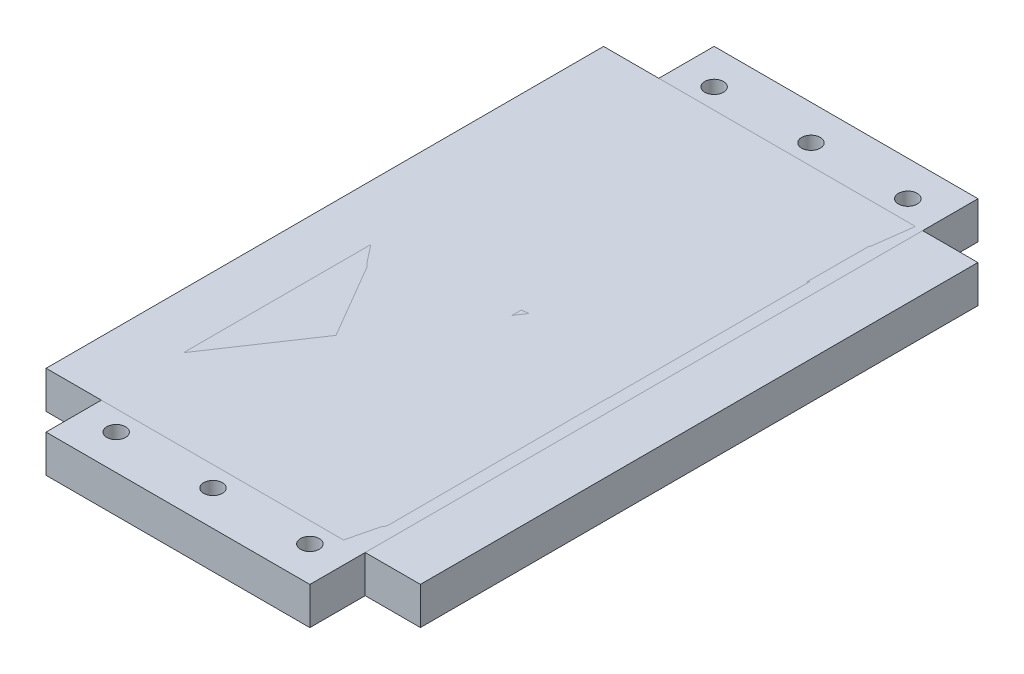
ISO-10303-21;
HEADER;
FILE_DESCRIPTION(('STEP AP214'),'2;1');
FILE_NAME('part.step','',(''),(''),'','','');
FILE_SCHEMA(('AUTOMOTIVE_DESIGN { 1 0 10303 214 1 1 1 1 }'));
ENDSEC;
DATA;
#1=APPLICATION_CONTEXT('core data for automotive mechanical design processes');
#2=APPLICATION_PROTOCOL_DEFINITION('international standard','automotive_design',2000,#1);
#3=PRODUCT_CONTEXT('',#1,'mechanical');
#4=PRODUCT('Part','Part','',(#3));
#5=PRODUCT_RELATED_PRODUCT_CATEGORY('part','',(#4));
#6=PRODUCT_DEFINITION_FORMATION('','',#4);
#7=PRODUCT_DEFINITION_CONTEXT('part definition',#1,'design');
#8=PRODUCT_DEFINITION('design','',#6,#7);
#9=PRODUCT_DEFINITION_SHAPE('','',#8);
#10=(LENGTH_UNIT() NAMED_UNIT(*) SI_UNIT(.MILLI.,.METRE.));
#11=(NAMED_UNIT(*) PLANE_ANGLE_UNIT() SI_UNIT($,.RADIAN.));
#12=(NAMED_UNIT(*) SI_UNIT($,.STERADIAN.) SOLID_ANGLE_UNIT());
#13=UNCERTAINTY_MEASURE_WITH_UNIT(LENGTH_MEASURE(1.E-05),#10,'distance_accuracy_value','');
#14=(GEOMETRIC_REPRESENTATION_CONTEXT(3) GLOBAL_UNCERTAINTY_ASSIGNED_CONTEXT((#13)) GLOBAL_UNIT_ASSIGNED_CONTEXT((#10,
#11,#12)) REPRESENTATION_CONTEXT('',''));
#15=CARTESIAN_POINT('',(0.,0.,0.));
#16=DIRECTION('',(0.,0.,1.));
#17=DIRECTION('',(1.,0.,0.));
#18=AXIS2_PLACEMENT_3D('',#15,#16,#17);
#19=CARTESIAN_POINT('',(68.2,0.,11.825));
#20=DIRECTION('',(1.,0.,0.));
#21=DIRECTION('',(0.,0.,-1.));
#22=AXIS2_PLACEMENT_3D('',#19,#20,#21);
#23=PLANE('',#22);
#24=DIRECTION('',(0.,0.,-1.));
#25=VECTOR('',#24,1.);
#26=CARTESIAN_POINT('',(68.2,8.,11.825));
#27=LINE('',#26,#25);
#28=CARTESIAN_POINT('',(68.2,8.,130.975));
#29=VERTEX_POINT('',#28);
#30=CARTESIAN_POINT('',(68.2,8.,11.825));
#31=VERTEX_POINT('',#30);
#32=EDGE_CURVE('E110',#29,#31,#27,.T.);
#33=ORIENTED_EDGE('',*,*,#32,.F.);
#34=DIRECTION('',(0.,1.,0.));
#35=VECTOR('',#34,1.);
#36=CARTESIAN_POINT('',(68.2,0.,130.975));
#37=LINE('',#36,#35);
#38=CARTESIAN_POINT('',(68.2,0.,130.975));
#39=VERTEX_POINT('',#38);
#40=EDGE_CURVE('E12',#39,#29,#37,.T.);
#41=ORIENTED_EDGE('',*,*,#40,.F.);
#42=DIRECTION('',(0.,0.,-1.));
#43=VECTOR('',#42,1.);
#44=CARTESIAN_POINT('',(68.2,0.,11.825));
#45=LINE('',#44,#43);
#46=CARTESIAN_POINT('',(68.2,0.,11.825));
#47=VERTEX_POINT('',#46);
#48=EDGE_CURVE('E104',#39,#47,#45,.T.);
#49=ORIENTED_EDGE('',*,*,#48,.T.);
#50=DIRECTION('',(0.,1.,0.));
#51=VECTOR('',#50,1.);
#52=CARTESIAN_POINT('',(68.2,0.,11.825));
#53=LINE('',#52,#51);
#54=EDGE_CURVE('E49',#47,#31,#53,.T.);
#55=ORIENTED_EDGE('',*,*,#54,.T.);
#56=EDGE_LOOP('',(#33,#41,#49,#55));
#57=FACE_BOUND('',#56,.T.);
#58=ADVANCED_FACE('F46',(#57),#23,.T.);
#59=CARTESIAN_POINT('',(-11.8,0.,130.975));
#60=DIRECTION('',(0.,0.,1.));
#61=DIRECTION('',(1.,0.,0.));
#62=AXIS2_PLACEMENT_3D('',#59,#60,#61);
#63=PLANE('',#62);
#64=DIRECTION('',(1.,0.,0.));
#65=VECTOR('',#64,1.);
#66=CARTESIAN_POINT('',(-11.8,8.,130.975));
#67=LINE('',#66,#65);
#68=CARTESIAN_POINT('',(-11.8,8.,130.975));
#69=VERTEX_POINT('',#68);
#70=EDGE_CURVE('E106',#69,#29,#67,.T.);
#71=ORIENTED_EDGE('',*,*,#70,.F.);
#72=DIRECTION('',(0.,1.,0.));
#73=VECTOR('',#72,1.);
#74=CARTESIAN_POINT('',(-11.8,0.,130.975));
#75=LINE('',#74,#73);
#76=CARTESIAN_POINT('',(-11.8,0.,130.975));
#77=VERTEX_POINT('',#76);
#78=EDGE_CURVE('E55',#77,#69,#75,.T.);
#79=ORIENTED_EDGE('',*,*,#78,.F.);
#80=DIRECTION('',(1.,0.,0.));
#81=VECTOR('',#80,1.);
#82=CARTESIAN_POINT('',(-11.8,0.,130.975));
#83=LINE('',#82,#81);
#84=EDGE_CURVE('E101',#77,#39,#83,.T.);
#85=ORIENTED_EDGE('',*,*,#84,.T.);
#86=ORIENTED_EDGE('',*,*,#40,.T.);
#87=EDGE_LOOP('',(#71,#79,#85,#86));
#88=FACE_BOUND('',#87,.T.);
#89=ADVANCED_FACE('F120',(#88),#63,.T.);
#90=CARTESIAN_POINT('',(-11.8,0.,11.825));
#91=DIRECTION('',(-1.,0.,0.));
#92=DIRECTION('',(0.,0.,1.));
#93=AXIS2_PLACEMENT_3D('',#90,#91,#92);
#94=PLANE('',#93);
#95=DIRECTION('',(0.,0.,1.));
#96=VECTOR('',#95,1.);
#97=CARTESIAN_POINT('',(-11.8,8.,11.825));
#98=LINE('',#97,#96);
#99=CARTESIAN_POINT('',(-11.8,8.,11.825));
#100=VERTEX_POINT('',#99);
#101=EDGE_CURVE('E96',#100,#69,#98,.T.);
#102=ORIENTED_EDGE('',*,*,#101,.F.);
#103=DIRECTION('',(0.,1.,0.));
#104=VECTOR('',#103,1.);
#105=CARTESIAN_POINT('',(-11.8,0.,11.825));
#106=LINE('',#105,#104);
#107=CARTESIAN_POINT('',(-11.8,0.,11.825));
#108=VERTEX_POINT('',#107);
#109=EDGE_CURVE('E91',#108,#100,#106,.T.);
#110=ORIENTED_EDGE('',*,*,#109,.F.);
#111=DIRECTION('',(0.,0.,1.));
#112=VECTOR('',#111,1.);
#113=CARTESIAN_POINT('',(-11.8,0.,11.825));
#114=LINE('',#113,#112);
#115=EDGE_CURVE('E94',#108,#77,#114,.T.);
#116=ORIENTED_EDGE('',*,*,#115,.T.);
#117=ORIENTED_EDGE('',*,*,#78,.T.);
#118=EDGE_LOOP('',(#102,#110,#116,#117));
#119=FACE_BOUND('',#118,.T.);
#120=ADVANCED_FACE('F93',(#119),#94,.T.);
#121=CARTESIAN_POINT('',(-11.8,0.,11.825));
#122=DIRECTION('',(0.,0.,-1.));
#123=DIRECTION('',(-1.,0.,0.));
#124=AXIS2_PLACEMENT_3D('',#121,#122,#123);
#125=PLANE('',#124);
#126=DIRECTION('',(-1.,0.,0.));
#127=VECTOR('',#126,1.);
#128=CARTESIAN_POINT('',(-11.8,8.,11.825));
#129=LINE('',#128,#127);
#130=EDGE_CURVE('E113',#31,#100,#129,.T.);
#131=ORIENTED_EDGE('',*,*,#130,.F.);
#132=ORIENTED_EDGE('',*,*,#54,.F.);
#133=DIRECTION('',(-1.,0.,0.));
#134=VECTOR('',#133,1.);
#135=CARTESIAN_POINT('',(-11.8,0.,11.825));
#136=LINE('',#135,#134);
#137=EDGE_CURVE('E100',#47,#108,#136,.T.);
#138=ORIENTED_EDGE('',*,*,#137,.T.);
#139=ORIENTED_EDGE('',*,*,#109,.T.);
#140=EDGE_LOOP('',(#131,#132,#138,#139));
#141=FACE_BOUND('',#140,.T.);
#142=ADVANCED_FACE('F103',(#141),#125,.T.);
#143=CARTESIAN_POINT('',(0.,0.,0.));
#144=DIRECTION('',(0.,1.,0.));
#145=DIRECTION('',(0.,0.,1.));
#146=AXIS2_PLACEMENT_3D('',#143,#144,#145);
#147=PLANE('',#146);
#148=ORIENTED_EDGE('',*,*,#48,.F.);
#149=ORIENTED_EDGE('',*,*,#84,.F.);
#150=ORIENTED_EDGE('',*,*,#115,.F.);
#151=ORIENTED_EDGE('',*,*,#137,.F.);
#152=EDGE_LOOP('',(#148,#149,#150,#151));
#153=FACE_BOUND('',#152,.T.);
#154=ADVANCED_FACE('F99',(#153),#147,.F.);
#155=CARTESIAN_POINT('',(0.,8.,0.));
#156=DIRECTION('',(0.,1.,0.));
#157=DIRECTION('',(0.,0.,1.));
#158=AXIS2_PLACEMENT_3D('',#155,#156,#157);
#159=PLANE('',#158);
#160=ORIENTED_EDGE('',*,*,#32,.T.);
#161=ORIENTED_EDGE('',*,*,#130,.T.);
#162=ORIENTED_EDGE('',*,*,#101,.T.);
#163=ORIENTED_EDGE('',*,*,#70,.T.);
#164=EDGE_LOOP('',(#160,#161,#162,#163));
#165=FACE_BOUND('',#164,.T.);
#166=ADVANCED_FACE('F119',(#165),#159,.T.);
#167=CLOSED_SHELL('',(#58,#89,#120,#142,#154,#166));
#168=MANIFOLD_SOLID_BREP('B2_NOT_SHOWN',#167);
#169=CARTESIAN_POINT('',(0.,8.,0.));
#170=DIRECTION('',(0.,1.,0.));
#171=DIRECTION('',(0.,0.,1.));
#172=AXIS2_PLACEMENT_3D('',#169,#170,#171);
#173=PLANE('',#172);
#174=DIRECTION('',(-1.,0.,0.));
#175=VECTOR('',#174,1.);
#176=CARTESIAN_POINT('',(-0.800000000000002,8.,69.4));
#177=LINE('',#176,#175);
#178=CARTESIAN_POINT('',(28.2,8.,69.4));
#179=VERTEX_POINT('',#178);
#180=CARTESIAN_POINT('',(0.,8.,69.4));
#181=VERTEX_POINT('',#180);
#182=EDGE_CURVE('E253',#179,#181,#177,.T.);
#183=ORIENTED_EDGE('',*,*,#182,.F.);
#184=DIRECTION('',(0.,0.,-1.));
#185=VECTOR('',#184,1.);
#186=CARTESIAN_POINT('',(28.2,8.,69.4));
#187=LINE('',#186,#185);
#188=CARTESIAN_POINT('',(28.2,8.,73.4));
#189=VERTEX_POINT('',#188);
#190=EDGE_CURVE('E269',#189,#179,#187,.T.);
#191=ORIENTED_EDGE('',*,*,#190,.F.);
#192=DIRECTION('',(1.,0.,0.));
#193=VECTOR('',#192,1.);
#194=CARTESIAN_POINT('',(-0.799999999999992,8.,73.4));
#195=LINE('',#194,#193);
#196=CARTESIAN_POINT('',(0.,8.,73.4));
#197=VERTEX_POINT('',#196);
#198=EDGE_CURVE('E258',#197,#189,#195,.T.);
#199=ORIENTED_EDGE('',*,*,#198,.F.);
#200=DIRECTION('',(0.,0.,1.));
#201=VECTOR('',#200,1.);
#202=CARTESIAN_POINT('',(0.,8.,0.));
#203=LINE('',#202,#201);
#204=CARTESIAN_POINT('',(0.,8.,142.8));
#205=VERTEX_POINT('',#204);
#206=EDGE_CURVE('E222',#197,#205,#203,.T.);
#207=ORIENTED_EDGE('',*,*,#206,.T.);
#208=DIRECTION('',(1.,0.,0.));
#209=VECTOR('',#208,1.);
#210=CARTESIAN_POINT('',(0.,8.,142.8));
#211=LINE('',#210,#209);
#212=CARTESIAN_POINT('',(56.4,8.,142.8));
#213=VERTEX_POINT('',#212);
#214=EDGE_CURVE('E366',#205,#213,#211,.T.);
#215=ORIENTED_EDGE('',*,*,#214,.T.);
#216=DIRECTION('',(0.,0.,-1.));
#217=VECTOR('',#216,1.);
#218=CARTESIAN_POINT('',(56.4,8.,0.));
#219=LINE('',#218,#217);
#220=CARTESIAN_POINT('',(56.4,8.,0.));
#221=VERTEX_POINT('',#220);
#222=EDGE_CURVE('E368',#213,#221,#219,.T.);
#223=ORIENTED_EDGE('',*,*,#222,.T.);
#224=DIRECTION('',(-1.,0.,0.));
#225=VECTOR('',#224,1.);
#226=CARTESIAN_POINT('',(0.,8.,0.));
#227=LINE('',#226,#225);
#228=CARTESIAN_POINT('',(0.,8.,0.));
#229=VERTEX_POINT('',#228);
#230=EDGE_CURVE('E194',#221,#229,#227,.T.);
#231=ORIENTED_EDGE('',*,*,#230,.T.);
#232=EDGE_CURVE('E364',#229,#181,#203,.T.);
#233=ORIENTED_EDGE('',*,*,#232,.T.);
#234=EDGE_LOOP('',(#183,#191,#199,#207,#215,#223,#231,#233));
#235=FACE_BOUND('',#234,.T.);
#236=CARTESIAN_POINT('',(28.2,8.,135.3));
#237=DIRECTION('',(0.,-1.,0.));
#238=DIRECTION('',(0.,0.,-1.));
#239=AXIS2_PLACEMENT_3D('',#236,#237,#238);
#240=CIRCLE('',#239,2.);
#241=CARTESIAN_POINT('',(28.2,8.,133.3));
#242=VERTEX_POINT('',#241);
#243=EDGE_CURVE('E277',#242,#242,#240,.T.);
#244=ORIENTED_EDGE('',*,*,#243,.T.);
#245=EDGE_LOOP('',(#244));
#246=FACE_BOUND('',#245,.T.);
#247=CARTESIAN_POINT('',(4.58,8.,75.98));
#248=DIRECTION('',(0.,-1.,0.));
#249=DIRECTION('',(0.,0.,1.));
#250=AXIS2_PLACEMENT_3D('',#247,#248,#249);
#251=CIRCLE('',#250,2.);
#252=CARTESIAN_POINT('',(4.58,8.,77.98));
#253=VERTEX_POINT('',#252);
#254=EDGE_CURVE('E301',#253,#253,#251,.T.);
#255=ORIENTED_EDGE('',*,*,#254,.T.);
#256=EDGE_LOOP('',(#255));
#257=FACE_BOUND('',#256,.T.);
#258=CARTESIAN_POINT('',(51.82,8.,123.22));
#259=DIRECTION('',(0.,-1.,0.));
#260=DIRECTION('',(0.,0.,1.));
#261=AXIS2_PLACEMENT_3D('',#258,#259,#260);
#262=CIRCLE('',#261,2.);
#263=CARTESIAN_POINT('',(51.82,8.,125.22));
#264=VERTEX_POINT('',#263);
#265=EDGE_CURVE('E307',#264,#264,#262,.T.);
#266=ORIENTED_EDGE('',*,*,#265,.T.);
#267=EDGE_LOOP('',(#266));
#268=FACE_BOUND('',#267,.T.);
#269=CARTESIAN_POINT('',(28.2,8.,43.2));
#270=DIRECTION('',(0.,1.,0.));
#271=DIRECTION('',(0.,0.,1.));
#272=AXIS2_PLACEMENT_3D('',#269,#270,#271);
#273=CIRCLE('',#272,16.);
#274=CARTESIAN_POINT('',(28.2,8.,59.2));
#275=VERTEX_POINT('',#274);
#276=EDGE_CURVE('E355',#275,#275,#273,.T.);
#277=ORIENTED_EDGE('',*,*,#276,.F.);
#278=EDGE_LOOP('',(#277));
#279=FACE_BOUND('',#278,.T.);
#280=CARTESIAN_POINT('',(4.58,8.,19.58));
#281=DIRECTION('',(0.,1.,0.));
#282=DIRECTION('',(0.,0.,1.));
#283=AXIS2_PLACEMENT_3D('',#280,#281,#282);
#284=CIRCLE('',#283,2.);
#285=CARTESIAN_POINT('',(4.58,8.,21.58));
#286=VERTEX_POINT('',#285);
#287=EDGE_CURVE('E343',#286,#286,#284,.T.);
#288=ORIENTED_EDGE('',*,*,#287,.F.);
#289=EDGE_LOOP('',(#288));
#290=FACE_BOUND('',#289,.T.);
#291=CARTESIAN_POINT('',(51.82,8.,19.58));
#292=DIRECTION('',(0.,1.,0.));
#293=DIRECTION('',(0.,0.,-1.));
#294=AXIS2_PLACEMENT_3D('',#291,#292,#293);
#295=CIRCLE('',#294,2.);
#296=CARTESIAN_POINT('',(51.82,8.,17.58));
#297=VERTEX_POINT('',#296);
#298=EDGE_CURVE('E337',#297,#297,#295,.T.);
#299=ORIENTED_EDGE('',*,*,#298,.F.);
#300=EDGE_LOOP('',(#299));
#301=FACE_BOUND('',#300,.T.);
#302=CARTESIAN_POINT('',(51.82,8.,66.82));
#303=DIRECTION('',(0.,1.,0.));
#304=DIRECTION('',(0.,0.,1.));
#305=AXIS2_PLACEMENT_3D('',#302,#303,#304);
#306=CIRCLE('',#305,2.);
#307=CARTESIAN_POINT('',(51.82,8.,68.82));
#308=VERTEX_POINT('',#307);
#309=EDGE_CURVE('E331',#308,#308,#306,.T.);
#310=ORIENTED_EDGE('',*,*,#309,.F.);
#311=EDGE_LOOP('',(#310));
#312=FACE_BOUND('',#311,.T.);
#313=CARTESIAN_POINT('',(4.58,8.,66.82));
#314=DIRECTION('',(0.,1.,0.));
#315=DIRECTION('',(0.,0.,-1.));
#316=AXIS2_PLACEMENT_3D('',#313,#314,#315);
#317=CIRCLE('',#316,2.);
#318=CARTESIAN_POINT('',(4.58,8.,64.82));
#319=VERTEX_POINT('',#318);
#320=EDGE_CURVE('E325',#319,#319,#317,.T.);
#321=ORIENTED_EDGE('',*,*,#320,.F.);
#322=EDGE_LOOP('',(#321));
#323=FACE_BOUND('',#322,.T.);
#324=CARTESIAN_POINT('',(28.2,8.,99.6));
#325=DIRECTION('',(0.,1.,0.));
#326=DIRECTION('',(0.,0.,1.));
#327=AXIS2_PLACEMENT_3D('',#324,#325,#326);
#328=CIRCLE('',#327,12.);
#329=CARTESIAN_POINT('',(28.2,8.,111.6));
#330=VERTEX_POINT('',#329);
#331=EDGE_CURVE('E319',#330,#330,#328,.T.);
#332=ORIENTED_EDGE('',*,*,#331,.F.);
#333=EDGE_LOOP('',(#332));
#334=FACE_BOUND('',#333,.T.);
#335=CARTESIAN_POINT('',(4.58,8.,123.22));
#336=DIRECTION('',(0.,-1.,0.));
#337=DIRECTION('',(0.,0.,-1.));
#338=AXIS2_PLACEMENT_3D('',#335,#336,#337);
#339=CIRCLE('',#338,2.);
#340=CARTESIAN_POINT('',(4.58,8.,121.22));
#341=VERTEX_POINT('',#340);
#342=EDGE_CURVE('E313',#341,#341,#339,.T.);
#343=ORIENTED_EDGE('',*,*,#342,.T.);
#344=EDGE_LOOP('',(#343));
#345=FACE_BOUND('',#344,.T.);
#346=CARTESIAN_POINT('',(51.82,8.,75.98));
#347=DIRECTION('',(0.,-1.,0.));
#348=DIRECTION('',(0.,0.,-1.));
#349=AXIS2_PLACEMENT_3D('',#346,#347,#348);
#350=CIRCLE('',#349,2.);
#351=CARTESIAN_POINT('',(51.82,8.,73.98));
#352=VERTEX_POINT('',#351);
#353=EDGE_CURVE('E300',#352,#352,#350,.T.);
#354=ORIENTED_EDGE('',*,*,#353,.T.);
#355=EDGE_LOOP('',(#354));
#356=FACE_BOUND('',#355,.T.);
#357=CARTESIAN_POINT('',(7.5,8.,7.5));
#358=DIRECTION('',(0.,1.,0.));
#359=DIRECTION('',(0.,0.,1.));
#360=AXIS2_PLACEMENT_3D('',#357,#358,#359);
#361=CIRCLE('',#360,2.);
#362=CARTESIAN_POINT('',(7.5,8.,9.5));
#363=VERTEX_POINT('',#362);
#364=EDGE_CURVE('E293',#363,#363,#361,.T.);
#365=ORIENTED_EDGE('',*,*,#364,.F.);
#366=EDGE_LOOP('',(#365));
#367=FACE_BOUND('',#366,.T.);
#368=CARTESIAN_POINT('',(28.2,8.,7.5));
#369=DIRECTION('',(0.,1.,0.));
#370=DIRECTION('',(0.,0.,1.));
#371=AXIS2_PLACEMENT_3D('',#368,#369,#370);
#372=CIRCLE('',#371,2.);
#373=CARTESIAN_POINT('',(28.2,8.,9.5));
#374=VERTEX_POINT('',#373);
#375=EDGE_CURVE('E289',#374,#374,#372,.T.);
#376=ORIENTED_EDGE('',*,*,#375,.F.);
#377=EDGE_LOOP('',(#376));
#378=FACE_BOUND('',#377,.T.);
#379=CARTESIAN_POINT('',(48.9,8.,7.50000000000001));
#380=DIRECTION('',(0.,1.,0.));
#381=DIRECTION('',(0.,0.,1.));
#382=AXIS2_PLACEMENT_3D('',#379,#380,#381);
#383=CIRCLE('',#382,2.);
#384=CARTESIAN_POINT('',(48.9,8.,9.50000000000001));
#385=VERTEX_POINT('',#384);
#386=EDGE_CURVE('E285',#385,#385,#383,.T.);
#387=ORIENTED_EDGE('',*,*,#386,.F.);
#388=EDGE_LOOP('',(#387));
#389=FACE_BOUND('',#388,.T.);
#390=CARTESIAN_POINT('',(7.5,8.,135.3));
#391=DIRECTION('',(0.,-1.,0.));
#392=DIRECTION('',(0.,0.,-1.));
#393=AXIS2_PLACEMENT_3D('',#390,#391,#392);
#394=CIRCLE('',#393,2.);
#395=CARTESIAN_POINT('',(7.5,8.,133.3));
#396=VERTEX_POINT('',#395);
#397=EDGE_CURVE('E281',#396,#396,#394,.T.);
#398=ORIENTED_EDGE('',*,*,#397,.T.);
#399=EDGE_LOOP('',(#398));
#400=FACE_BOUND('',#399,.T.);
#401=CARTESIAN_POINT('',(48.9,8.,135.3));
#402=DIRECTION('',(0.,-1.,0.));
#403=DIRECTION('',(0.,0.,-1.));
#404=AXIS2_PLACEMENT_3D('',#401,#402,#403);
#405=CIRCLE('',#404,2.);
#406=CARTESIAN_POINT('',(48.9,8.,133.3));
#407=VERTEX_POINT('',#406);
#408=EDGE_CURVE('E272',#407,#407,#405,.T.);
#409=ORIENTED_EDGE('',*,*,#408,.T.);
#410=EDGE_LOOP('',(#409));
#411=FACE_BOUND('',#410,.T.);
#412=ADVANCED_FACE('F170',(#235,#246,#257,#268,#279,#290,#301,#312,#323,#334,#345,#356,#367,
#378,#389,#400,#411),#173,.T.);
#413=CARTESIAN_POINT('',(0.,0.,0.));
#414=DIRECTION('',(0.,1.,0.));
#415=DIRECTION('',(0.,0.,1.));
#416=AXIS2_PLACEMENT_3D('',#413,#414,#415);
#417=PLANE('',#416);
#418=CARTESIAN_POINT('',(28.2,0.,135.3));
#419=DIRECTION('',(0.,1.,0.));
#420=DIRECTION('',(0.,0.,1.));
#421=AXIS2_PLACEMENT_3D('',#418,#419,#420);
#422=CIRCLE('',#421,2.);
#423=CARTESIAN_POINT('',(28.2,0.,137.3));
#424=VERTEX_POINT('',#423);
#425=EDGE_CURVE('E280',#424,#424,#422,.F.);
#426=ORIENTED_EDGE('',*,*,#425,.F.);
#427=EDGE_LOOP('',(#426));
#428=FACE_BOUND('',#427,.T.);
#429=CARTESIAN_POINT('',(4.58,0.,75.98));
#430=DIRECTION('',(0.,-1.,0.));
#431=DIRECTION('',(0.,0.,1.));
#432=AXIS2_PLACEMENT_3D('',#429,#430,#431);
#433=CIRCLE('',#432,2.);
#434=CARTESIAN_POINT('',(4.58,0.,77.98));
#435=VERTEX_POINT('',#434);
#436=EDGE_CURVE('E297',#435,#435,#433,.T.);
#437=ORIENTED_EDGE('',*,*,#436,.F.);
#438=EDGE_LOOP('',(#437));
#439=FACE_BOUND('',#438,.T.);
#440=CARTESIAN_POINT('',(51.82,0.,123.22));
#441=DIRECTION('',(0.,-1.,0.));
#442=DIRECTION('',(0.,0.,1.));
#443=AXIS2_PLACEMENT_3D('',#440,#441,#442);
#444=CIRCLE('',#443,2.);
#445=CARTESIAN_POINT('',(51.82,0.,125.22));
#446=VERTEX_POINT('',#445);
#447=EDGE_CURVE('E310',#446,#446,#444,.T.);
#448=ORIENTED_EDGE('',*,*,#447,.F.);
#449=EDGE_LOOP('',(#448));
#450=FACE_BOUND('',#449,.T.);
#451=DIRECTION('',(0.,0.,1.));
#452=VECTOR('',#451,1.);
#453=CARTESIAN_POINT('',(0.,0.,0.));
#454=LINE('',#453,#452);
#455=CARTESIAN_POINT('',(0.,0.,0.));
#456=VERTEX_POINT('',#455);
#457=CARTESIAN_POINT('',(0.,0.,142.8));
#458=VERTEX_POINT('',#457);
#459=EDGE_CURVE('E361',#456,#458,#454,.T.);
#460=ORIENTED_EDGE('',*,*,#459,.F.);
#461=DIRECTION('',(-1.,0.,0.));
#462=VECTOR('',#461,1.);
#463=CARTESIAN_POINT('',(0.,0.,0.));
#464=LINE('',#463,#462);
#465=CARTESIAN_POINT('',(56.4,0.,0.));
#466=VERTEX_POINT('',#465);
#467=EDGE_CURVE('E215',#466,#456,#464,.T.);
#468=ORIENTED_EDGE('',*,*,#467,.F.);
#469=DIRECTION('',(0.,0.,-1.));
#470=VECTOR('',#469,1.);
#471=CARTESIAN_POINT('',(56.4,0.,0.));
#472=LINE('',#471,#470);
#473=CARTESIAN_POINT('',(56.4,0.,142.8));
#474=VERTEX_POINT('',#473);
#475=EDGE_CURVE('E376',#474,#466,#472,.T.);
#476=ORIENTED_EDGE('',*,*,#475,.F.);
#477=DIRECTION('',(1.,0.,0.));
#478=VECTOR('',#477,1.);
#479=CARTESIAN_POINT('',(0.,0.,142.8));
#480=LINE('',#479,#478);
#481=EDGE_CURVE('E374',#458,#474,#480,.T.);
#482=ORIENTED_EDGE('',*,*,#481,.F.);
#483=EDGE_LOOP('',(#460,#468,#476,#482));
#484=FACE_BOUND('',#483,.T.);
#485=CARTESIAN_POINT('',(28.2,0.,43.2));
#486=DIRECTION('',(0.,1.,0.));
#487=DIRECTION('',(0.,0.,1.));
#488=AXIS2_PLACEMENT_3D('',#485,#486,#487);
#489=CIRCLE('',#488,10.);
#490=CARTESIAN_POINT('',(28.2,0.,53.2));
#491=VERTEX_POINT('',#490);
#492=EDGE_CURVE('E352',#491,#491,#489,.T.);
#493=ORIENTED_EDGE('',*,*,#492,.T.);
#494=EDGE_LOOP('',(#493));
#495=FACE_BOUND('',#494,.T.);
#496=CARTESIAN_POINT('',(4.58,0.,19.58));
#497=DIRECTION('',(0.,1.,0.));
#498=DIRECTION('',(0.,0.,1.));
#499=AXIS2_PLACEMENT_3D('',#496,#497,#498);
#500=CIRCLE('',#499,2.);
#501=CARTESIAN_POINT('',(4.58,0.,21.58));
#502=VERTEX_POINT('',#501);
#503=EDGE_CURVE('E346',#502,#502,#500,.T.);
#504=ORIENTED_EDGE('',*,*,#503,.T.);
#505=EDGE_LOOP('',(#504));
#506=FACE_BOUND('',#505,.T.);
#507=CARTESIAN_POINT('',(51.82,0.,19.58));
#508=DIRECTION('',(0.,1.,0.));
#509=DIRECTION('',(0.,0.,-1.));
#510=AXIS2_PLACEMENT_3D('',#507,#508,#509);
#511=CIRCLE('',#510,2.);
#512=CARTESIAN_POINT('',(51.82,0.,17.58));
#513=VERTEX_POINT('',#512);
#514=EDGE_CURVE('E340',#513,#513,#511,.T.);
#515=ORIENTED_EDGE('',*,*,#514,.T.);
#516=EDGE_LOOP('',(#515));
#517=FACE_BOUND('',#516,.T.);
#518=CARTESIAN_POINT('',(51.82,0.,66.82));
#519=DIRECTION('',(0.,1.,0.));
#520=DIRECTION('',(0.,0.,1.));
#521=AXIS2_PLACEMENT_3D('',#518,#519,#520);
#522=CIRCLE('',#521,2.);
#523=CARTESIAN_POINT('',(51.82,0.,68.82));
#524=VERTEX_POINT('',#523);
#525=EDGE_CURVE('E334',#524,#524,#522,.T.);
#526=ORIENTED_EDGE('',*,*,#525,.T.);
#527=EDGE_LOOP('',(#526));
#528=FACE_BOUND('',#527,.T.);
#529=CARTESIAN_POINT('',(4.58,0.,66.82));
#530=DIRECTION('',(0.,1.,0.));
#531=DIRECTION('',(0.,0.,-1.));
#532=AXIS2_PLACEMENT_3D('',#529,#530,#531);
#533=CIRCLE('',#532,2.);
#534=CARTESIAN_POINT('',(4.58,0.,64.82));
#535=VERTEX_POINT('',#534);
#536=EDGE_CURVE('E328',#535,#535,#533,.T.);
#537=ORIENTED_EDGE('',*,*,#536,.T.);
#538=EDGE_LOOP('',(#537));
#539=FACE_BOUND('',#538,.T.);
#540=CARTESIAN_POINT('',(28.2,0.,99.6));
#541=DIRECTION('',(0.,1.,0.));
#542=DIRECTION('',(0.,0.,1.));
#543=AXIS2_PLACEMENT_3D('',#540,#541,#542);
#544=CIRCLE('',#543,12.);
#545=CARTESIAN_POINT('',(28.2,0.,111.6));
#546=VERTEX_POINT('',#545);
#547=EDGE_CURVE('E322',#546,#546,#544,.T.);
#548=ORIENTED_EDGE('',*,*,#547,.T.);
#549=EDGE_LOOP('',(#548));
#550=FACE_BOUND('',#549,.T.);
#551=CARTESIAN_POINT('',(4.58,0.,123.22));
#552=DIRECTION('',(0.,-1.,0.));
#553=DIRECTION('',(0.,0.,-1.));
#554=AXIS2_PLACEMENT_3D('',#551,#552,#553);
#555=CIRCLE('',#554,2.);
#556=CARTESIAN_POINT('',(4.58,0.,121.22));
#557=VERTEX_POINT('',#556);
#558=EDGE_CURVE('E316',#557,#557,#555,.T.);
#559=ORIENTED_EDGE('',*,*,#558,.F.);
#560=EDGE_LOOP('',(#559));
#561=FACE_BOUND('',#560,.T.);
#562=CARTESIAN_POINT('',(51.82,0.,75.98));
#563=DIRECTION('',(0.,-1.,0.));
#564=DIRECTION('',(0.,0.,-1.));
#565=AXIS2_PLACEMENT_3D('',#562,#563,#564);
#566=CIRCLE('',#565,2.);
#567=CARTESIAN_POINT('',(51.82,0.,73.98));
#568=VERTEX_POINT('',#567);
#569=EDGE_CURVE('E304',#568,#568,#566,.T.);
#570=ORIENTED_EDGE('',*,*,#569,.F.);
#571=EDGE_LOOP('',(#570));
#572=FACE_BOUND('',#571,.T.);
#573=CARTESIAN_POINT('',(7.5,0.,7.5));
#574=DIRECTION('',(0.,1.,0.));
#575=DIRECTION('',(0.,0.,1.));
#576=AXIS2_PLACEMENT_3D('',#573,#574,#575);
#577=CIRCLE('',#576,2.);
#578=CARTESIAN_POINT('',(7.5,0.,9.5));
#579=VERTEX_POINT('',#578);
#580=EDGE_CURVE('E296',#579,#579,#577,.T.);
#581=ORIENTED_EDGE('',*,*,#580,.T.);
#582=EDGE_LOOP('',(#581));
#583=FACE_BOUND('',#582,.T.);
#584=CARTESIAN_POINT('',(28.2,0.,7.5));
#585=DIRECTION('',(0.,1.,0.));
#586=DIRECTION('',(0.,0.,1.));
#587=AXIS2_PLACEMENT_3D('',#584,#585,#586);
#588=CIRCLE('',#587,2.);
#589=CARTESIAN_POINT('',(28.2,0.,9.5));
#590=VERTEX_POINT('',#589);
#591=EDGE_CURVE('E292',#590,#590,#588,.T.);
#592=ORIENTED_EDGE('',*,*,#591,.T.);
#593=EDGE_LOOP('',(#592));
#594=FACE_BOUND('',#593,.T.);
#595=CARTESIAN_POINT('',(48.9,0.,7.50000000000001));
#596=DIRECTION('',(0.,1.,0.));
#597=DIRECTION('',(0.,0.,1.));
#598=AXIS2_PLACEMENT_3D('',#595,#596,#597);
#599=CIRCLE('',#598,2.);
#600=CARTESIAN_POINT('',(48.9,0.,9.50000000000001));
#601=VERTEX_POINT('',#600);
#602=EDGE_CURVE('E288',#601,#601,#599,.T.);
#603=ORIENTED_EDGE('',*,*,#602,.T.);
#604=EDGE_LOOP('',(#603));
#605=FACE_BOUND('',#604,.T.);
#606=CARTESIAN_POINT('',(7.5,0.,135.3));
#607=DIRECTION('',(0.,1.,0.));
#608=DIRECTION('',(0.,0.,1.));
#609=AXIS2_PLACEMENT_3D('',#606,#607,#608);
#610=CIRCLE('',#609,2.);
#611=CARTESIAN_POINT('',(7.5,0.,137.3));
#612=VERTEX_POINT('',#611);
#613=EDGE_CURVE('E284',#612,#612,#610,.F.);
#614=ORIENTED_EDGE('',*,*,#613,.F.);
#615=EDGE_LOOP('',(#614));
#616=FACE_BOUND('',#615,.T.);
#617=CARTESIAN_POINT('',(48.9,0.,135.3));
#618=DIRECTION('',(0.,1.,0.));
#619=DIRECTION('',(0.,0.,1.));
#620=AXIS2_PLACEMENT_3D('',#617,#618,#619);
#621=CIRCLE('',#620,2.);
#622=CARTESIAN_POINT('',(48.9,0.,137.3));
#623=VERTEX_POINT('',#622);
#624=EDGE_CURVE('E276',#623,#623,#621,.F.);
#625=ORIENTED_EDGE('',*,*,#624,.F.);
#626=EDGE_LOOP('',(#625));
#627=FACE_BOUND('',#626,.T.);
#628=ADVANCED_FACE('F409',(#428,#439,#450,#484,#495,#506,#517,#528,#539,#550,#561,#572,#583,
#594,#605,#616,#627),#417,.F.);
#629=CARTESIAN_POINT('',(0.,8.,0.));
#630=DIRECTION('',(1.,0.,0.));
#631=DIRECTION('',(0.,0.,-1.));
#632=AXIS2_PLACEMENT_3D('',#629,#630,#631);
#633=PLANE('',#632);
#634=DIRECTION('',(0.,0.,1.));
#635=VECTOR('',#634,1.);
#636=CARTESIAN_POINT('',(0.,5.,0.));
#637=LINE('',#636,#635);
#638=CARTESIAN_POINT('',(0.,5.,69.4));
#639=VERTEX_POINT('',#638);
#640=CARTESIAN_POINT('',(0.,5.,73.4));
#641=VERTEX_POINT('',#640);
#642=EDGE_CURVE('E250',#639,#641,#637,.T.);
#643=ORIENTED_EDGE('',*,*,#642,.F.);
#644=DIRECTION('',(0.,1.,0.));
#645=VECTOR('',#644,1.);
#646=CARTESIAN_POINT('',(0.,8.,69.4));
#647=LINE('',#646,#645);
#648=EDGE_CURVE('E44',#639,#181,#647,.T.);
#649=ORIENTED_EDGE('',*,*,#648,.T.);
#650=ORIENTED_EDGE('',*,*,#232,.F.);
#651=DIRECTION('',(0.,-1.,0.));
#652=VECTOR('',#651,1.);
#653=CARTESIAN_POINT('',(0.,8.,0.));
#654=LINE('',#653,#652);
#655=EDGE_CURVE('E371',#229,#456,#654,.T.);
#656=ORIENTED_EDGE('',*,*,#655,.T.);
#657=ORIENTED_EDGE('',*,*,#459,.T.);
#658=DIRECTION('',(0.,-1.,0.));
#659=VECTOR('',#658,1.);
#660=CARTESIAN_POINT('',(0.,8.,142.8));
#661=LINE('',#660,#659);
#662=EDGE_CURVE('E385',#205,#458,#661,.T.);
#663=ORIENTED_EDGE('',*,*,#662,.F.);
#664=ORIENTED_EDGE('',*,*,#206,.F.);
#665=DIRECTION('',(0.,-1.,0.));
#666=VECTOR('',#665,1.);
#667=CARTESIAN_POINT('',(0.,8.,73.4));
#668=LINE('',#667,#666);
#669=EDGE_CURVE('E178',#197,#641,#668,.T.);
#670=ORIENTED_EDGE('',*,*,#669,.T.);
#671=EDGE_LOOP('',(#643,#649,#650,#656,#657,#663,#664,#670));
#672=FACE_BOUND('',#671,.T.);
#673=ADVANCED_FACE('F172',(#672),#633,.F.);
#674=CARTESIAN_POINT('',(0.,8.,142.8));
#675=DIRECTION('',(0.,0.,-1.));
#676=DIRECTION('',(-1.,0.,0.));
#677=AXIS2_PLACEMENT_3D('',#674,#675,#676);
#678=PLANE('',#677);
#679=ORIENTED_EDGE('',*,*,#481,.T.);
#680=DIRECTION('',(0.,-1.,0.));
#681=VECTOR('',#680,1.);
#682=CARTESIAN_POINT('',(56.4,8.,142.8));
#683=LINE('',#682,#681);
#684=EDGE_CURVE('E382',#213,#474,#683,.T.);
#685=ORIENTED_EDGE('',*,*,#684,.F.);
#686=ORIENTED_EDGE('',*,*,#214,.F.);
#687=ORIENTED_EDGE('',*,*,#662,.T.);
#688=EDGE_LOOP('',(#679,#685,#686,#687));
#689=FACE_BOUND('',#688,.T.);
#690=ADVANCED_FACE('F414',(#689),#678,.F.);
#691=CARTESIAN_POINT('',(56.4,8.,0.));
#692=DIRECTION('',(-1.,0.,0.));
#693=DIRECTION('',(0.,0.,1.));
#694=AXIS2_PLACEMENT_3D('',#691,#692,#693);
#695=PLANE('',#694);
#696=ORIENTED_EDGE('',*,*,#475,.T.);
#697=DIRECTION('',(0.,-1.,0.));
#698=VECTOR('',#697,1.);
#699=CARTESIAN_POINT('',(56.4,8.,0.));
#700=LINE('',#699,#698);
#701=EDGE_CURVE('E380',#221,#466,#700,.T.);
#702=ORIENTED_EDGE('',*,*,#701,.F.);
#703=ORIENTED_EDGE('',*,*,#222,.F.);
#704=ORIENTED_EDGE('',*,*,#684,.T.);
#705=EDGE_LOOP('',(#696,#702,#703,#704));
#706=FACE_BOUND('',#705,.T.);
#707=ADVANCED_FACE('F418',(#706),#695,.F.);
#708=CARTESIAN_POINT('',(0.,8.,0.));
#709=DIRECTION('',(0.,0.,1.));
#710=DIRECTION('',(1.,0.,0.));
#711=AXIS2_PLACEMENT_3D('',#708,#709,#710);
#712=PLANE('',#711);
#713=ORIENTED_EDGE('',*,*,#467,.T.);
#714=ORIENTED_EDGE('',*,*,#655,.F.);
#715=ORIENTED_EDGE('',*,*,#230,.F.);
#716=ORIENTED_EDGE('',*,*,#701,.T.);
#717=EDGE_LOOP('',(#713,#714,#715,#716));
#718=FACE_BOUND('',#717,.T.);
#719=ADVANCED_FACE('F419',(#718),#712,.F.);
#720=CARTESIAN_POINT('',(28.2,2.,43.2));
#721=DIRECTION('',(0.,1.,0.));
#722=DIRECTION('',(0.,0.,1.));
#723=AXIS2_PLACEMENT_3D('',#720,#721,#722);
#724=CYLINDRICAL_SURFACE('',#723,16.);
#725=CARTESIAN_POINT('',(28.2,2.,43.2));
#726=DIRECTION('',(0.,1.,0.));
#727=DIRECTION('',(0.,0.,1.));
#728=AXIS2_PLACEMENT_3D('',#725,#726,#727);
#729=CIRCLE('',#728,16.);
#730=CARTESIAN_POINT('',(28.2,2.,59.2));
#731=VERTEX_POINT('',#730);
#732=EDGE_CURVE('E358',#731,#731,#729,.T.);
#733=ORIENTED_EDGE('',*,*,#732,.F.);
#734=EDGE_LOOP('',(#733));
#735=FACE_BOUND('',#734,.T.);
#736=ORIENTED_EDGE('',*,*,#276,.T.);
#737=EDGE_LOOP('',(#736));
#738=FACE_BOUND('',#737,.T.);
#739=ADVANCED_FACE('F421',(#735,#738),#724,.F.);
#740=CARTESIAN_POINT('',(28.2,2.,43.2));
#741=DIRECTION('',(0.,1.,0.));
#742=DIRECTION('',(0.,0.,1.));
#743=AXIS2_PLACEMENT_3D('',#740,#741,#742);
#744=PLANE('',#743);
#745=CARTESIAN_POINT('',(28.2,2.,43.2));
#746=DIRECTION('',(0.,1.,0.));
#747=DIRECTION('',(0.,0.,1.));
#748=AXIS2_PLACEMENT_3D('',#745,#746,#747);
#749=CIRCLE('',#748,10.);
#750=CARTESIAN_POINT('',(28.2,2.,53.2));
#751=VERTEX_POINT('',#750);
#752=EDGE_CURVE('E349',#751,#751,#749,.T.);
#753=ORIENTED_EDGE('',*,*,#752,.F.);
#754=EDGE_LOOP('',(#753));
#755=FACE_BOUND('',#754,.T.);
#756=ORIENTED_EDGE('',*,*,#732,.T.);
#757=EDGE_LOOP('',(#756));
#758=FACE_BOUND('',#757,.T.);
#759=ADVANCED_FACE('F427',(#755,#758),#744,.T.);
#760=CARTESIAN_POINT('',(28.2,0.,43.2));
#761=DIRECTION('',(0.,1.,0.));
#762=DIRECTION('',(0.,0.,1.));
#763=AXIS2_PLACEMENT_3D('',#760,#761,#762);
#764=CYLINDRICAL_SURFACE('',#763,10.);
#765=ORIENTED_EDGE('',*,*,#492,.F.);
#766=EDGE_LOOP('',(#765));
#767=FACE_BOUND('',#766,.T.);
#768=ORIENTED_EDGE('',*,*,#752,.T.);
#769=EDGE_LOOP('',(#768));
#770=FACE_BOUND('',#769,.T.);
#771=ADVANCED_FACE('F443',(#767,#770),#764,.F.);
#772=CARTESIAN_POINT('',(4.58,0.,19.58));
#773=DIRECTION('',(0.,1.,0.));
#774=DIRECTION('',(0.,0.,1.));
#775=AXIS2_PLACEMENT_3D('',#772,#773,#774);
#776=CYLINDRICAL_SURFACE('',#775,2.);
#777=ORIENTED_EDGE('',*,*,#503,.F.);
#778=EDGE_LOOP('',(#777));
#779=FACE_BOUND('',#778,.T.);
#780=ORIENTED_EDGE('',*,*,#287,.T.);
#781=EDGE_LOOP('',(#780));
#782=FACE_BOUND('',#781,.T.);
#783=ADVANCED_FACE('F447',(#779,#782),#776,.F.);
#784=CARTESIAN_POINT('',(51.82,0.,19.58));
#785=DIRECTION('',(0.,1.,0.));
#786=DIRECTION('',(0.,0.,1.));
#787=AXIS2_PLACEMENT_3D('',#784,#785,#786);
#788=CYLINDRICAL_SURFACE('',#787,2.);
#789=ORIENTED_EDGE('',*,*,#514,.F.);
#790=EDGE_LOOP('',(#789));
#791=FACE_BOUND('',#790,.T.);
#792=ORIENTED_EDGE('',*,*,#298,.T.);
#793=EDGE_LOOP('',(#792));
#794=FACE_BOUND('',#793,.T.);
#795=ADVANCED_FACE('F451',(#791,#794),#788,.F.);
#796=CARTESIAN_POINT('',(51.82,0.,66.82));
#797=DIRECTION('',(0.,1.,0.));
#798=DIRECTION('',(0.,0.,1.));
#799=AXIS2_PLACEMENT_3D('',#796,#797,#798);
#800=CYLINDRICAL_SURFACE('',#799,2.);
#801=ORIENTED_EDGE('',*,*,#525,.F.);
#802=EDGE_LOOP('',(#801));
#803=FACE_BOUND('',#802,.T.);
#804=ORIENTED_EDGE('',*,*,#309,.T.);
#805=EDGE_LOOP('',(#804));
#806=FACE_BOUND('',#805,.T.);
#807=ADVANCED_FACE('F455',(#803,#806),#800,.F.);
#808=CARTESIAN_POINT('',(4.58,0.,66.82));
#809=DIRECTION('',(0.,1.,0.));
#810=DIRECTION('',(0.,0.,1.));
#811=AXIS2_PLACEMENT_3D('',#808,#809,#810);
#812=CYLINDRICAL_SURFACE('',#811,2.);
#813=ORIENTED_EDGE('',*,*,#536,.F.);
#814=EDGE_LOOP('',(#813));
#815=FACE_BOUND('',#814,.T.);
#816=ORIENTED_EDGE('',*,*,#320,.T.);
#817=EDGE_LOOP('',(#816));
#818=FACE_BOUND('',#817,.T.);
#819=ADVANCED_FACE('F459',(#815,#818),#812,.F.);
#820=CARTESIAN_POINT('',(28.2,0.,99.6));
#821=DIRECTION('',(0.,1.,0.));
#822=DIRECTION('',(0.,0.,1.));
#823=AXIS2_PLACEMENT_3D('',#820,#821,#822);
#824=CYLINDRICAL_SURFACE('',#823,12.);
#825=ORIENTED_EDGE('',*,*,#547,.F.);
#826=EDGE_LOOP('',(#825));
#827=FACE_BOUND('',#826,.T.);
#828=ORIENTED_EDGE('',*,*,#331,.T.);
#829=EDGE_LOOP('',(#828));
#830=FACE_BOUND('',#829,.T.);
#831=ADVANCED_FACE('F463',(#827,#830),#824,.F.);
#832=CARTESIAN_POINT('',(4.58,0.,123.22));
#833=DIRECTION('',(0.,1.,0.));
#834=DIRECTION('',(0.,0.,1.));
#835=AXIS2_PLACEMENT_3D('',#832,#833,#834);
#836=CYLINDRICAL_SURFACE('',#835,2.);
#837=ORIENTED_EDGE('',*,*,#558,.T.);
#838=EDGE_LOOP('',(#837));
#839=FACE_BOUND('',#838,.T.);
#840=ORIENTED_EDGE('',*,*,#342,.F.);
#841=EDGE_LOOP('',(#840));
#842=FACE_BOUND('',#841,.T.);
#843=ADVANCED_FACE('F467',(#839,#842),#836,.F.);
#844=CARTESIAN_POINT('',(51.82,0.,123.22));
#845=DIRECTION('',(0.,1.,0.));
#846=DIRECTION('',(0.,0.,1.));
#847=AXIS2_PLACEMENT_3D('',#844,#845,#846);
#848=CYLINDRICAL_SURFACE('',#847,2.);
#849=ORIENTED_EDGE('',*,*,#447,.T.);
#850=EDGE_LOOP('',(#849));
#851=FACE_BOUND('',#850,.T.);
#852=ORIENTED_EDGE('',*,*,#265,.F.);
#853=EDGE_LOOP('',(#852));
#854=FACE_BOUND('',#853,.T.);
#855=ADVANCED_FACE('F471',(#851,#854),#848,.F.);
#856=CARTESIAN_POINT('',(51.82,0.,75.98));
#857=DIRECTION('',(0.,1.,0.));
#858=DIRECTION('',(0.,0.,1.));
#859=AXIS2_PLACEMENT_3D('',#856,#857,#858);
#860=CYLINDRICAL_SURFACE('',#859,2.);
#861=ORIENTED_EDGE('',*,*,#569,.T.);
#862=EDGE_LOOP('',(#861));
#863=FACE_BOUND('',#862,.T.);
#864=ORIENTED_EDGE('',*,*,#353,.F.);
#865=EDGE_LOOP('',(#864));
#866=FACE_BOUND('',#865,.T.);
#867=ADVANCED_FACE('F475',(#863,#866),#860,.F.);
#868=CARTESIAN_POINT('',(4.58,0.,75.98));
#869=DIRECTION('',(0.,1.,0.));
#870=DIRECTION('',(0.,0.,1.));
#871=AXIS2_PLACEMENT_3D('',#868,#869,#870);
#872=CYLINDRICAL_SURFACE('',#871,2.);
#873=ORIENTED_EDGE('',*,*,#436,.T.);
#874=EDGE_LOOP('',(#873));
#875=FACE_BOUND('',#874,.T.);
#876=ORIENTED_EDGE('',*,*,#254,.F.);
#877=EDGE_LOOP('',(#876));
#878=FACE_BOUND('',#877,.T.);
#879=ADVANCED_FACE('F479',(#875,#878),#872,.F.);
#880=CARTESIAN_POINT('',(7.5,-2.,7.5));
#881=DIRECTION('',(0.,1.,0.));
#882=DIRECTION('',(0.,0.,1.));
#883=AXIS2_PLACEMENT_3D('',#880,#881,#882);
#884=CYLINDRICAL_SURFACE('',#883,2.);
#885=ORIENTED_EDGE('',*,*,#364,.T.);
#886=EDGE_LOOP('',(#885));
#887=FACE_BOUND('',#886,.T.);
#888=ORIENTED_EDGE('',*,*,#580,.F.);
#889=EDGE_LOOP('',(#888));
#890=FACE_BOUND('',#889,.T.);
#891=ADVANCED_FACE('F483',(#887,#890),#884,.F.);
#892=CARTESIAN_POINT('',(28.2,-2.,7.5));
#893=DIRECTION('',(0.,1.,0.));
#894=DIRECTION('',(0.,0.,1.));
#895=AXIS2_PLACEMENT_3D('',#892,#893,#894);
#896=CYLINDRICAL_SURFACE('',#895,2.);
#897=ORIENTED_EDGE('',*,*,#375,.T.);
#898=EDGE_LOOP('',(#897));
#899=FACE_BOUND('',#898,.T.);
#900=ORIENTED_EDGE('',*,*,#591,.F.);
#901=EDGE_LOOP('',(#900));
#902=FACE_BOUND('',#901,.T.);
#903=ADVANCED_FACE('F487',(#899,#902),#896,.F.);
#904=CARTESIAN_POINT('',(48.9,-2.,7.50000000000001));
#905=DIRECTION('',(0.,1.,0.));
#906=DIRECTION('',(0.,0.,1.));
#907=AXIS2_PLACEMENT_3D('',#904,#905,#906);
#908=CYLINDRICAL_SURFACE('',#907,2.);
#909=ORIENTED_EDGE('',*,*,#386,.T.);
#910=EDGE_LOOP('',(#909));
#911=FACE_BOUND('',#910,.T.);
#912=ORIENTED_EDGE('',*,*,#602,.F.);
#913=EDGE_LOOP('',(#912));
#914=FACE_BOUND('',#913,.T.);
#915=ADVANCED_FACE('F491',(#911,#914),#908,.F.);
#916=CARTESIAN_POINT('',(7.5,-2.,135.3));
#917=DIRECTION('',(0.,1.,0.));
#918=DIRECTION('',(0.,0.,1.));
#919=AXIS2_PLACEMENT_3D('',#916,#917,#918);
#920=CYLINDRICAL_SURFACE('',#919,2.);
#921=ORIENTED_EDGE('',*,*,#397,.F.);
#922=EDGE_LOOP('',(#921));
#923=FACE_BOUND('',#922,.T.);
#924=ORIENTED_EDGE('',*,*,#613,.T.);
#925=EDGE_LOOP('',(#924));
#926=FACE_BOUND('',#925,.T.);
#927=ADVANCED_FACE('F495',(#923,#926),#920,.F.);
#928=CARTESIAN_POINT('',(28.2,-2.,135.3));
#929=DIRECTION('',(0.,1.,0.));
#930=DIRECTION('',(0.,0.,1.));
#931=AXIS2_PLACEMENT_3D('',#928,#929,#930);
#932=CYLINDRICAL_SURFACE('',#931,2.);
#933=ORIENTED_EDGE('',*,*,#243,.F.);
#934=EDGE_LOOP('',(#933));
#935=FACE_BOUND('',#934,.T.);
#936=ORIENTED_EDGE('',*,*,#425,.T.);
#937=EDGE_LOOP('',(#936));
#938=FACE_BOUND('',#937,.T.);
#939=ADVANCED_FACE('F499',(#935,#938),#932,.F.);
#940=CARTESIAN_POINT('',(48.9,-2.,135.3));
#941=DIRECTION('',(0.,1.,0.));
#942=DIRECTION('',(0.,0.,1.));
#943=AXIS2_PLACEMENT_3D('',#940,#941,#942);
#944=CYLINDRICAL_SURFACE('',#943,2.);
#945=ORIENTED_EDGE('',*,*,#408,.F.);
#946=EDGE_LOOP('',(#945));
#947=FACE_BOUND('',#946,.T.);
#948=ORIENTED_EDGE('',*,*,#624,.T.);
#949=EDGE_LOOP('',(#948));
#950=FACE_BOUND('',#949,.T.);
#951=ADVANCED_FACE('F503',(#947,#950),#944,.F.);
#952=CARTESIAN_POINT('',(-0.800000000000002,5.,69.4));
#953=DIRECTION('',(0.,0.,-1.));
#954=DIRECTION('',(-1.,0.,0.));
#955=AXIS2_PLACEMENT_3D('',#952,#953,#954);
#956=PLANE('',#955);
#957=DIRECTION('',(-1.,0.,0.));
#958=VECTOR('',#957,1.);
#959=CARTESIAN_POINT('',(-0.800000000000002,5.,69.4));
#960=LINE('',#959,#958);
#961=CARTESIAN_POINT('',(28.2,5.,69.4));
#962=VERTEX_POINT('',#961);
#963=EDGE_CURVE('E185',#962,#639,#960,.T.);
#964=ORIENTED_EDGE('',*,*,#963,.F.);
#965=DIRECTION('',(0.,1.,0.));
#966=VECTOR('',#965,1.);
#967=CARTESIAN_POINT('',(28.2,5.,69.4));
#968=LINE('',#967,#966);
#969=EDGE_CURVE('E262',#962,#179,#968,.T.);
#970=ORIENTED_EDGE('',*,*,#969,.T.);
#971=ORIENTED_EDGE('',*,*,#182,.T.);
#972=ORIENTED_EDGE('',*,*,#648,.F.);
#973=EDGE_LOOP('',(#964,#970,#971,#972));
#974=FACE_BOUND('',#973,.T.);
#975=ADVANCED_FACE('F406',(#974),#956,.F.);
#976=CARTESIAN_POINT('',(-0.799999999999992,5.,73.4));
#977=DIRECTION('',(0.,0.,1.));
#978=DIRECTION('',(1.,0.,0.));
#979=AXIS2_PLACEMENT_3D('',#976,#977,#978);
#980=PLANE('',#979);
#981=ORIENTED_EDGE('',*,*,#198,.T.);
#982=DIRECTION('',(0.,1.,0.));
#983=VECTOR('',#982,1.);
#984=CARTESIAN_POINT('',(28.2,5.,73.4));
#985=LINE('',#984,#983);
#986=CARTESIAN_POINT('',(28.2,5.,73.4));
#987=VERTEX_POINT('',#986);
#988=EDGE_CURVE('E256',#987,#189,#985,.T.);
#989=ORIENTED_EDGE('',*,*,#988,.F.);
#990=DIRECTION('',(1.,0.,0.));
#991=VECTOR('',#990,1.);
#992=CARTESIAN_POINT('',(-0.799999999999992,5.,73.4));
#993=LINE('',#992,#991);
#994=EDGE_CURVE('E244',#641,#987,#993,.T.);
#995=ORIENTED_EDGE('',*,*,#994,.F.);
#996=ORIENTED_EDGE('',*,*,#669,.F.);
#997=EDGE_LOOP('',(#981,#989,#995,#996));
#998=FACE_BOUND('',#997,.T.);
#999=ADVANCED_FACE('F257',(#998),#980,.F.);
#1000=CARTESIAN_POINT('',(0.,5.,0.));
#1001=DIRECTION('',(0.,1.,0.));
#1002=DIRECTION('',(0.,0.,1.));
#1003=AXIS2_PLACEMENT_3D('',#1000,#1001,#1002);
#1004=PLANE('',#1003);
#1005=ORIENTED_EDGE('',*,*,#642,.T.);
#1006=ORIENTED_EDGE('',*,*,#994,.T.);
#1007=DIRECTION('',(0.,0.,-1.));
#1008=VECTOR('',#1007,1.);
#1009=CARTESIAN_POINT('',(28.2,5.,69.4));
#1010=LINE('',#1009,#1008);
#1011=EDGE_CURVE('E248',#987,#962,#1010,.T.);
#1012=ORIENTED_EDGE('',*,*,#1011,.T.);
#1013=ORIENTED_EDGE('',*,*,#963,.T.);
#1014=EDGE_LOOP('',(#1005,#1006,#1012,#1013));
#1015=FACE_BOUND('',#1014,.T.);
#1016=ADVANCED_FACE('F246',(#1015),#1004,.T.);
#1017=CARTESIAN_POINT('',(28.2,5.,69.4));
#1018=DIRECTION('',(1.,0.,0.));
#1019=DIRECTION('',(0.,0.,-1.));
#1020=AXIS2_PLACEMENT_3D('',#1017,#1018,#1019);
#1021=PLANE('',#1020);
#1022=ORIENTED_EDGE('',*,*,#190,.T.);
#1023=ORIENTED_EDGE('',*,*,#969,.F.);
#1024=ORIENTED_EDGE('',*,*,#1011,.F.);
#1025=ORIENTED_EDGE('',*,*,#988,.T.);
#1026=EDGE_LOOP('',(#1022,#1023,#1024,#1025));
#1027=FACE_BOUND('',#1026,.T.);
#1028=ADVANCED_FACE('F264',(#1027),#1021,.F.);
#1029=CLOSED_SHELL('',(#412,#628,#673,#690,#707,#719,#739,#759,#771,#783,#795,#807,#819,#831,
#843,#855,#867,#879,#891,#903,#915,#927,#939,#951,#975,#999,#1016,#1028));
#1030=MANIFOLD_SOLID_BREP('B6',#1029);
#1031=ADVANCED_BREP_SHAPE_REPRESENTATION('',(#18,#168,#1030),#14);
#1032=SHAPE_DEFINITION_REPRESENTATION(#9,#1031);
ENDSEC;
END-ISO-10303-21;
